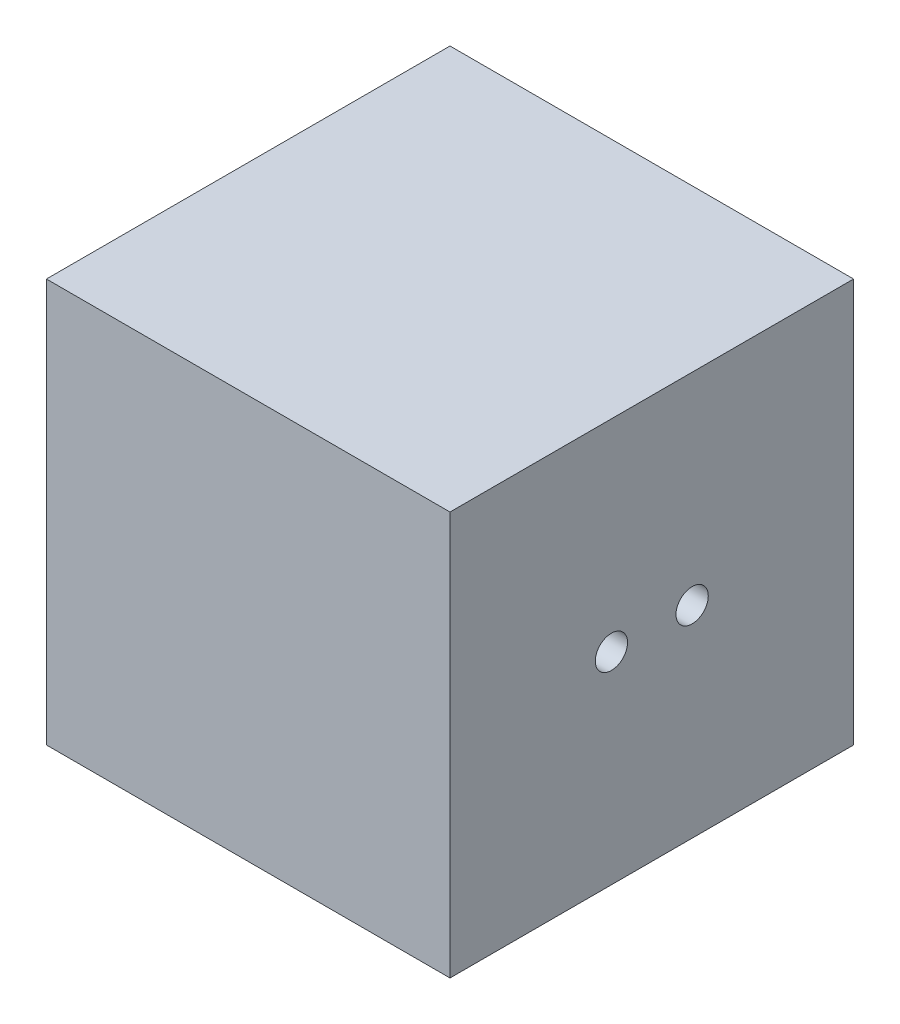
ISO-10303-21;
HEADER;
FILE_DESCRIPTION(('STEP AP214'),'2;1');
FILE_NAME('part.step','',(''),(''),'','','');
FILE_SCHEMA(('AUTOMOTIVE_DESIGN { 1 0 10303 214 1 1 1 1 }'));
ENDSEC;
DATA;
#1=APPLICATION_CONTEXT('core data for automotive mechanical design processes');
#2=APPLICATION_PROTOCOL_DEFINITION('international standard','automotive_design',2000,#1);
#3=PRODUCT_CONTEXT('',#1,'mechanical');
#4=PRODUCT('Part','Part','',(#3));
#5=PRODUCT_RELATED_PRODUCT_CATEGORY('part','',(#4));
#6=PRODUCT_DEFINITION_FORMATION('','',#4);
#7=PRODUCT_DEFINITION_CONTEXT('part definition',#1,'design');
#8=PRODUCT_DEFINITION('design','',#6,#7);
#9=PRODUCT_DEFINITION_SHAPE('','',#8);
#10=(LENGTH_UNIT() NAMED_UNIT(*) SI_UNIT(.MILLI.,.METRE.));
#11=(NAMED_UNIT(*) PLANE_ANGLE_UNIT() SI_UNIT($,.RADIAN.));
#12=(NAMED_UNIT(*) SI_UNIT($,.STERADIAN.) SOLID_ANGLE_UNIT());
#13=UNCERTAINTY_MEASURE_WITH_UNIT(LENGTH_MEASURE(1.E-05),#10,'distance_accuracy_value','');
#14=(GEOMETRIC_REPRESENTATION_CONTEXT(3) GLOBAL_UNCERTAINTY_ASSIGNED_CONTEXT((#13)) GLOBAL_UNIT_ASSIGNED_CONTEXT((#10,
#11,#12)) REPRESENTATION_CONTEXT('',''));
#15=CARTESIAN_POINT('',(0.,0.,0.));
#16=DIRECTION('',(0.,0.,1.));
#17=DIRECTION('',(1.,0.,0.));
#18=AXIS2_PLACEMENT_3D('',#15,#16,#17);
#19=CARTESIAN_POINT('',(50.,-50.,100.));
#20=DIRECTION('',(-1.,0.,0.));
#21=DIRECTION('',(0.,0.,1.));
#22=AXIS2_PLACEMENT_3D('',#19,#20,#21);
#23=PLANE('',#22);
#24=CARTESIAN_POINT('',(50.,0.,40.));
#25=DIRECTION('',(1.,0.,0.));
#26=DIRECTION('',(0.,0.,-1.));
#27=AXIS2_PLACEMENT_3D('',#24,#25,#26);
#28=CIRCLE('',#27,4.);
#29=CARTESIAN_POINT('',(50.,0.,36.));
#30=VERTEX_POINT('',#29);
#31=EDGE_CURVE('E113',#30,#30,#28,.T.);
#32=ORIENTED_EDGE('',*,*,#31,.F.);
#33=EDGE_LOOP('',(#32));
#34=FACE_BOUND('',#33,.T.);
#35=CARTESIAN_POINT('',(50.,0.,60.));
#36=DIRECTION('',(1.,0.,0.));
#37=DIRECTION('',(0.,0.,-1.));
#38=AXIS2_PLACEMENT_3D('',#35,#36,#37);
#39=CIRCLE('',#38,4.00000000000001);
#40=CARTESIAN_POINT('',(50.,0.,56.));
#41=VERTEX_POINT('',#40);
#42=EDGE_CURVE('E114',#41,#41,#39,.T.);
#43=ORIENTED_EDGE('',*,*,#42,.F.);
#44=EDGE_LOOP('',(#43));
#45=FACE_BOUND('',#44,.T.);
#46=DIRECTION('',(0.,1.,0.));
#47=VECTOR('',#46,1.);
#48=CARTESIAN_POINT('',(50.,-50.,0.));
#49=LINE('',#48,#47);
#50=CARTESIAN_POINT('',(50.,-50.,0.));
#51=VERTEX_POINT('',#50);
#52=CARTESIAN_POINT('',(50.,50.,0.));
#53=VERTEX_POINT('',#52);
#54=EDGE_CURVE('E96',#51,#53,#49,.T.);
#55=ORIENTED_EDGE('',*,*,#54,.T.);
#56=DIRECTION('',(0.,0.,-1.));
#57=VECTOR('',#56,1.);
#58=CARTESIAN_POINT('',(50.,50.,100.));
#59=LINE('',#58,#57);
#60=CARTESIAN_POINT('',(50.,50.,100.));
#61=VERTEX_POINT('',#60);
#62=EDGE_CURVE('E11',#61,#53,#59,.T.);
#63=ORIENTED_EDGE('',*,*,#62,.F.);
#64=DIRECTION('',(0.,1.,0.));
#65=VECTOR('',#64,1.);
#66=CARTESIAN_POINT('',(50.,-50.,100.));
#67=LINE('',#66,#65);
#68=CARTESIAN_POINT('',(50.,-50.,100.));
#69=VERTEX_POINT('',#68);
#70=EDGE_CURVE('E84',#69,#61,#67,.T.);
#71=ORIENTED_EDGE('',*,*,#70,.F.);
#72=DIRECTION('',(0.,0.,-1.));
#73=VECTOR('',#72,1.);
#74=CARTESIAN_POINT('',(50.,-50.,100.));
#75=LINE('',#74,#73);
#76=EDGE_CURVE('E92',#69,#51,#75,.T.);
#77=ORIENTED_EDGE('',*,*,#76,.T.);
#78=EDGE_LOOP('',(#55,#63,#71,#77));
#79=FACE_BOUND('',#78,.T.);
#80=ADVANCED_FACE('F33',(#34,#45,#79),#23,.F.);
#81=CARTESIAN_POINT('',(-50.,50.,100.));
#82=DIRECTION('',(0.,-1.,0.));
#83=DIRECTION('',(1.,0.,0.));
#84=AXIS2_PLACEMENT_3D('',#81,#82,#83);
#85=PLANE('',#84);
#86=DIRECTION('',(-1.,0.,0.));
#87=VECTOR('',#86,1.);
#88=CARTESIAN_POINT('',(-50.,50.,0.));
#89=LINE('',#88,#87);
#90=CARTESIAN_POINT('',(-50.,50.,0.));
#91=VERTEX_POINT('',#90);
#92=EDGE_CURVE('E88',#53,#91,#89,.T.);
#93=ORIENTED_EDGE('',*,*,#92,.T.);
#94=DIRECTION('',(0.,0.,-1.));
#95=VECTOR('',#94,1.);
#96=CARTESIAN_POINT('',(-50.,50.,100.));
#97=LINE('',#96,#95);
#98=CARTESIAN_POINT('',(-50.,50.,100.));
#99=VERTEX_POINT('',#98);
#100=EDGE_CURVE('E41',#99,#91,#97,.T.);
#101=ORIENTED_EDGE('',*,*,#100,.F.);
#102=DIRECTION('',(-1.,0.,0.));
#103=VECTOR('',#102,1.);
#104=CARTESIAN_POINT('',(-50.,50.,100.));
#105=LINE('',#104,#103);
#106=EDGE_CURVE('E79',#61,#99,#105,.T.);
#107=ORIENTED_EDGE('',*,*,#106,.F.);
#108=ORIENTED_EDGE('',*,*,#62,.T.);
#109=EDGE_LOOP('',(#93,#101,#107,#108));
#110=FACE_BOUND('',#109,.T.);
#111=ADVANCED_FACE('F87',(#110),#85,.F.);
#112=CARTESIAN_POINT('',(-50.,-50.,100.));
#113=DIRECTION('',(1.,0.,0.));
#114=DIRECTION('',(0.,1.,0.));
#115=AXIS2_PLACEMENT_3D('',#112,#113,#114);
#116=PLANE('',#115);
#117=CARTESIAN_POINT('',(-50.,0.,40.));
#118=DIRECTION('',(1.,0.,0.));
#119=DIRECTION('',(0.,1.,0.));
#120=AXIS2_PLACEMENT_3D('',#117,#118,#119);
#121=CIRCLE('',#120,4.);
#122=CARTESIAN_POINT('',(-50.,4.,40.));
#123=VERTEX_POINT('',#122);
#124=EDGE_CURVE('E99',#123,#123,#121,.F.);
#125=ORIENTED_EDGE('',*,*,#124,.F.);
#126=EDGE_LOOP('',(#125));
#127=FACE_BOUND('',#126,.T.);
#128=CARTESIAN_POINT('',(-50.,0.,60.));
#129=DIRECTION('',(1.,0.,0.));
#130=DIRECTION('',(0.,1.,0.));
#131=AXIS2_PLACEMENT_3D('',#128,#129,#130);
#132=CIRCLE('',#131,4.00000000000001);
#133=CARTESIAN_POINT('',(-50.,4.00000000000001,60.));
#134=VERTEX_POINT('',#133);
#135=EDGE_CURVE('E110',#134,#134,#132,.F.);
#136=ORIENTED_EDGE('',*,*,#135,.F.);
#137=EDGE_LOOP('',(#136));
#138=FACE_BOUND('',#137,.T.);
#139=DIRECTION('',(0.,-1.,0.));
#140=VECTOR('',#139,1.);
#141=CARTESIAN_POINT('',(-50.,-50.,0.));
#142=LINE('',#141,#140);
#143=CARTESIAN_POINT('',(-50.,-50.,0.));
#144=VERTEX_POINT('',#143);
#145=EDGE_CURVE('E66',#91,#144,#142,.T.);
#146=ORIENTED_EDGE('',*,*,#145,.T.);
#147=DIRECTION('',(0.,0.,-1.));
#148=VECTOR('',#147,1.);
#149=CARTESIAN_POINT('',(-50.,-50.,100.));
#150=LINE('',#149,#148);
#151=CARTESIAN_POINT('',(-50.,-50.,100.));
#152=VERTEX_POINT('',#151);
#153=EDGE_CURVE('E89',#152,#144,#150,.T.);
#154=ORIENTED_EDGE('',*,*,#153,.F.);
#155=DIRECTION('',(0.,-1.,0.));
#156=VECTOR('',#155,1.);
#157=CARTESIAN_POINT('',(-50.,-50.,100.));
#158=LINE('',#157,#156);
#159=EDGE_CURVE('E82',#99,#152,#158,.T.);
#160=ORIENTED_EDGE('',*,*,#159,.F.);
#161=ORIENTED_EDGE('',*,*,#100,.T.);
#162=EDGE_LOOP('',(#146,#154,#160,#161));
#163=FACE_BOUND('',#162,.T.);
#164=ADVANCED_FACE('F90',(#127,#138,#163),#116,.F.);
#165=CARTESIAN_POINT('',(-50.,-50.,100.));
#166=DIRECTION('',(0.,1.,0.));
#167=DIRECTION('',(-1.,0.,0.));
#168=AXIS2_PLACEMENT_3D('',#165,#166,#167);
#169=PLANE('',#168);
#170=CARTESIAN_POINT('',(21.6506350946087,-50.,62.5000000000012));
#171=DIRECTION('',(0.,-1.,0.));
#172=DIRECTION('',(1.,0.,0.));
#173=AXIS2_PLACEMENT_3D('',#170,#171,#172);
#174=CIRCLE('',#173,1.7);
#175=CARTESIAN_POINT('',(23.3506350946087,-50.,62.5000000000012));
#176=VERTEX_POINT('',#175);
#177=EDGE_CURVE('E128',#176,#176,#174,.T.);
#178=ORIENTED_EDGE('',*,*,#177,.F.);
#179=EDGE_LOOP('',(#178));
#180=FACE_BOUND('',#179,.T.);
#181=CARTESIAN_POINT('',(-21.6506350946133,-50.,62.4999999999987));
#182=DIRECTION('',(0.,-1.,0.));
#183=DIRECTION('',(1.,0.,0.));
#184=AXIS2_PLACEMENT_3D('',#181,#182,#183);
#185=CIRCLE('',#184,1.7);
#186=CARTESIAN_POINT('',(-19.9506350946133,-50.,62.4999999999987));
#187=VERTEX_POINT('',#186);
#188=EDGE_CURVE('E134',#187,#187,#185,.T.);
#189=ORIENTED_EDGE('',*,*,#188,.F.);
#190=EDGE_LOOP('',(#189));
#191=FACE_BOUND('',#190,.T.);
#192=CARTESIAN_POINT('',(0.,-50.,25.));
#193=DIRECTION('',(0.,-1.,0.));
#194=DIRECTION('',(1.,0.,0.));
#195=AXIS2_PLACEMENT_3D('',#192,#193,#194);
#196=CIRCLE('',#195,1.7);
#197=CARTESIAN_POINT('',(1.70000000000001,-50.,25.));
#198=VERTEX_POINT('',#197);
#199=EDGE_CURVE('E140',#198,#198,#196,.T.);
#200=ORIENTED_EDGE('',*,*,#199,.F.);
#201=EDGE_LOOP('',(#200));
#202=FACE_BOUND('',#201,.T.);
#203=CARTESIAN_POINT('',(0.,-50.,50.));
#204=DIRECTION('',(0.,-1.,0.));
#205=DIRECTION('',(1.,0.,0.));
#206=AXIS2_PLACEMENT_3D('',#203,#204,#205);
#207=CIRCLE('',#206,7.);
#208=CARTESIAN_POINT('',(7.00000000000001,-50.,50.));
#209=VERTEX_POINT('',#208);
#210=EDGE_CURVE('E122',#209,#209,#207,.T.);
#211=ORIENTED_EDGE('',*,*,#210,.F.);
#212=EDGE_LOOP('',(#211));
#213=FACE_BOUND('',#212,.T.);
#214=DIRECTION('',(1.,0.,0.));
#215=VECTOR('',#214,1.);
#216=CARTESIAN_POINT('',(-50.,-50.,0.));
#217=LINE('',#216,#215);
#218=EDGE_CURVE('E72',#144,#51,#217,.T.);
#219=ORIENTED_EDGE('',*,*,#218,.T.);
#220=ORIENTED_EDGE('',*,*,#76,.F.);
#221=DIRECTION('',(1.,0.,0.));
#222=VECTOR('',#221,1.);
#223=CARTESIAN_POINT('',(-50.,-50.,100.));
#224=LINE('',#223,#222);
#225=EDGE_CURVE('E49',#152,#69,#224,.T.);
#226=ORIENTED_EDGE('',*,*,#225,.F.);
#227=ORIENTED_EDGE('',*,*,#153,.T.);
#228=EDGE_LOOP('',(#219,#220,#226,#227));
#229=FACE_BOUND('',#228,.T.);
#230=ADVANCED_FACE('F104',(#180,#191,#202,#213,#229),#169,.F.);
#231=CARTESIAN_POINT('',(0.,0.,100.));
#232=DIRECTION('',(0.,0.,-1.));
#233=DIRECTION('',(-1.,0.,0.));
#234=AXIS2_PLACEMENT_3D('',#231,#232,#233);
#235=PLANE('',#234);
#236=ORIENTED_EDGE('',*,*,#70,.T.);
#237=ORIENTED_EDGE('',*,*,#106,.T.);
#238=ORIENTED_EDGE('',*,*,#159,.T.);
#239=ORIENTED_EDGE('',*,*,#225,.T.);
#240=EDGE_LOOP('',(#236,#237,#238,#239));
#241=FACE_BOUND('',#240,.T.);
#242=ADVANCED_FACE('F80',(#241),#235,.F.);
#243=CARTESIAN_POINT('',(0.,0.,0.));
#244=DIRECTION('',(0.,0.,-1.));
#245=DIRECTION('',(-1.,0.,0.));
#246=AXIS2_PLACEMENT_3D('',#243,#244,#245);
#247=PLANE('',#246);
#248=ORIENTED_EDGE('',*,*,#54,.F.);
#249=ORIENTED_EDGE('',*,*,#218,.F.);
#250=ORIENTED_EDGE('',*,*,#145,.F.);
#251=ORIENTED_EDGE('',*,*,#92,.F.);
#252=EDGE_LOOP('',(#248,#249,#250,#251));
#253=FACE_BOUND('',#252,.T.);
#254=ADVANCED_FACE('F107',(#253),#247,.T.);
#255=CARTESIAN_POINT('',(-50.001,0.,60.));
#256=DIRECTION('',(1.,0.,0.));
#257=DIRECTION('',(0.,0.,-1.));
#258=AXIS2_PLACEMENT_3D('',#255,#256,#257);
#259=CYLINDRICAL_SURFACE('',#258,4.00000000000001);
#260=ORIENTED_EDGE('',*,*,#42,.T.);
#261=EDGE_LOOP('',(#260));
#262=FACE_BOUND('',#261,.T.);
#263=ORIENTED_EDGE('',*,*,#135,.T.);
#264=EDGE_LOOP('',(#263));
#265=FACE_BOUND('',#264,.T.);
#266=ADVANCED_FACE('F172',(#262,#265),#259,.F.);
#267=CARTESIAN_POINT('',(-50.001,0.,40.));
#268=DIRECTION('',(1.,0.,0.));
#269=DIRECTION('',(0.,0.,-1.));
#270=AXIS2_PLACEMENT_3D('',#267,#268,#269);
#271=CYLINDRICAL_SURFACE('',#270,4.);
#272=ORIENTED_EDGE('',*,*,#31,.T.);
#273=EDGE_LOOP('',(#272));
#274=FACE_BOUND('',#273,.T.);
#275=ORIENTED_EDGE('',*,*,#124,.T.);
#276=EDGE_LOOP('',(#275));
#277=FACE_BOUND('',#276,.T.);
#278=ADVANCED_FACE('F163',(#274,#277),#271,.F.);
#279=CARTESIAN_POINT('',(0.,-40.,50.));
#280=DIRECTION('',(0.,-1.,0.));
#281=DIRECTION('',(1.,0.,0.));
#282=AXIS2_PLACEMENT_3D('',#279,#280,#281);
#283=CYLINDRICAL_SURFACE('',#282,7.);
#284=CARTESIAN_POINT('',(0.,-40.,50.));
#285=DIRECTION('',(0.,-1.,0.));
#286=DIRECTION('',(1.,0.,0.));
#287=AXIS2_PLACEMENT_3D('',#284,#285,#286);
#288=CIRCLE('',#287,7.);
#289=CARTESIAN_POINT('',(7.,-40.,50.));
#290=VERTEX_POINT('',#289);
#291=EDGE_CURVE('E117',#290,#290,#288,.T.);
#292=ORIENTED_EDGE('',*,*,#291,.F.);
#293=EDGE_LOOP('',(#292));
#294=FACE_BOUND('',#293,.T.);
#295=ORIENTED_EDGE('',*,*,#210,.T.);
#296=EDGE_LOOP('',(#295));
#297=FACE_BOUND('',#296,.T.);
#298=ADVANCED_FACE('F161',(#294,#297),#283,.F.);
#299=CARTESIAN_POINT('',(0.,-40.,50.));
#300=DIRECTION('',(0.,-1.,0.));
#301=DIRECTION('',(1.,0.,0.));
#302=AXIS2_PLACEMENT_3D('',#299,#300,#301);
#303=PLANE('',#302);
#304=ORIENTED_EDGE('',*,*,#291,.T.);
#305=EDGE_LOOP('',(#304));
#306=FACE_BOUND('',#305,.T.);
#307=ADVANCED_FACE('F151',(#306),#303,.T.);
#308=CARTESIAN_POINT('',(0.,-40.,25.));
#309=DIRECTION('',(0.,-1.,0.));
#310=DIRECTION('',(1.,0.,0.));
#311=AXIS2_PLACEMENT_3D('',#308,#309,#310);
#312=CYLINDRICAL_SURFACE('',#311,1.7);
#313=CARTESIAN_POINT('',(0.,-40.,25.));
#314=DIRECTION('',(0.,-1.,0.));
#315=DIRECTION('',(1.,0.,0.));
#316=AXIS2_PLACEMENT_3D('',#313,#314,#315);
#317=CIRCLE('',#316,1.7);
#318=CARTESIAN_POINT('',(1.70000000000001,-40.,25.));
#319=VERTEX_POINT('',#318);
#320=EDGE_CURVE('E125',#319,#319,#317,.T.);
#321=ORIENTED_EDGE('',*,*,#320,.F.);
#322=EDGE_LOOP('',(#321));
#323=FACE_BOUND('',#322,.T.);
#324=ORIENTED_EDGE('',*,*,#199,.T.);
#325=EDGE_LOOP('',(#324));
#326=FACE_BOUND('',#325,.T.);
#327=ADVANCED_FACE('F148',(#323,#326),#312,.F.);
#328=CARTESIAN_POINT('',(0.,-40.,25.));
#329=DIRECTION('',(0.,-1.,0.));
#330=DIRECTION('',(1.,0.,0.));
#331=AXIS2_PLACEMENT_3D('',#328,#329,#330);
#332=PLANE('',#331);
#333=ORIENTED_EDGE('',*,*,#320,.T.);
#334=EDGE_LOOP('',(#333));
#335=FACE_BOUND('',#334,.T.);
#336=ADVANCED_FACE('F146',(#335),#332,.T.);
#337=CARTESIAN_POINT('',(-21.6506350946133,-40.,62.4999999999987));
#338=DIRECTION('',(0.,-1.,0.));
#339=DIRECTION('',(1.,0.,0.));
#340=AXIS2_PLACEMENT_3D('',#337,#338,#339);
#341=CYLINDRICAL_SURFACE('',#340,1.7);
#342=CARTESIAN_POINT('',(-21.6506350946133,-40.,62.4999999999987));
#343=DIRECTION('',(0.,-1.,0.));
#344=DIRECTION('',(1.,0.,0.));
#345=AXIS2_PLACEMENT_3D('',#342,#343,#344);
#346=CIRCLE('',#345,1.7);
#347=CARTESIAN_POINT('',(-19.9506350946133,-40.,62.4999999999987));
#348=VERTEX_POINT('',#347);
#349=EDGE_CURVE('E137',#348,#348,#346,.T.);
#350=ORIENTED_EDGE('',*,*,#349,.F.);
#351=EDGE_LOOP('',(#350));
#352=FACE_BOUND('',#351,.T.);
#353=ORIENTED_EDGE('',*,*,#188,.T.);
#354=EDGE_LOOP('',(#353));
#355=FACE_BOUND('',#354,.T.);
#356=ADVANCED_FACE('F244',(#352,#355),#341,.F.);
#357=CARTESIAN_POINT('',(-21.6506350946133,-40.,62.4999999999987));
#358=DIRECTION('',(0.,-1.,0.));
#359=DIRECTION('',(1.,0.,0.));
#360=AXIS2_PLACEMENT_3D('',#357,#358,#359);
#361=PLANE('',#360);
#362=ORIENTED_EDGE('',*,*,#349,.T.);
#363=EDGE_LOOP('',(#362));
#364=FACE_BOUND('',#363,.T.);
#365=ADVANCED_FACE('F253',(#364),#361,.T.);
#366=CARTESIAN_POINT('',(21.6506350946087,-40.,62.5000000000012));
#367=DIRECTION('',(0.,-1.,0.));
#368=DIRECTION('',(1.,0.,0.));
#369=AXIS2_PLACEMENT_3D('',#366,#367,#368);
#370=CYLINDRICAL_SURFACE('',#369,1.7);
#371=CARTESIAN_POINT('',(21.6506350946087,-40.,62.5000000000012));
#372=DIRECTION('',(0.,-1.,0.));
#373=DIRECTION('',(1.,0.,0.));
#374=AXIS2_PLACEMENT_3D('',#371,#372,#373);
#375=CIRCLE('',#374,1.7);
#376=CARTESIAN_POINT('',(23.3506350946087,-40.,62.5000000000012));
#377=VERTEX_POINT('',#376);
#378=EDGE_CURVE('E131',#377,#377,#375,.T.);
#379=ORIENTED_EDGE('',*,*,#378,.F.);
#380=EDGE_LOOP('',(#379));
#381=FACE_BOUND('',#380,.T.);
#382=ORIENTED_EDGE('',*,*,#177,.T.);
#383=EDGE_LOOP('',(#382));
#384=FACE_BOUND('',#383,.T.);
#385=ADVANCED_FACE('F263',(#381,#384),#370,.F.);
#386=CARTESIAN_POINT('',(21.6506350946087,-40.,62.5000000000012));
#387=DIRECTION('',(0.,-1.,0.));
#388=DIRECTION('',(1.,0.,0.));
#389=AXIS2_PLACEMENT_3D('',#386,#387,#388);
#390=PLANE('',#389);
#391=ORIENTED_EDGE('',*,*,#378,.T.);
#392=EDGE_LOOP('',(#391));
#393=FACE_BOUND('',#392,.T.);
#394=ADVANCED_FACE('F273',(#393),#390,.T.);
#395=CLOSED_SHELL('',(#80,#111,#164,#230,#242,#254,#266,#278,#298,#307,#327,#336,#356,#365,#385,#394));
#396=MANIFOLD_SOLID_BREP('B2',#395);
#397=ADVANCED_BREP_SHAPE_REPRESENTATION('',(#18,#396),#14);
#398=SHAPE_DEFINITION_REPRESENTATION(#9,#397);
ENDSEC;
END-ISO-10303-21;
